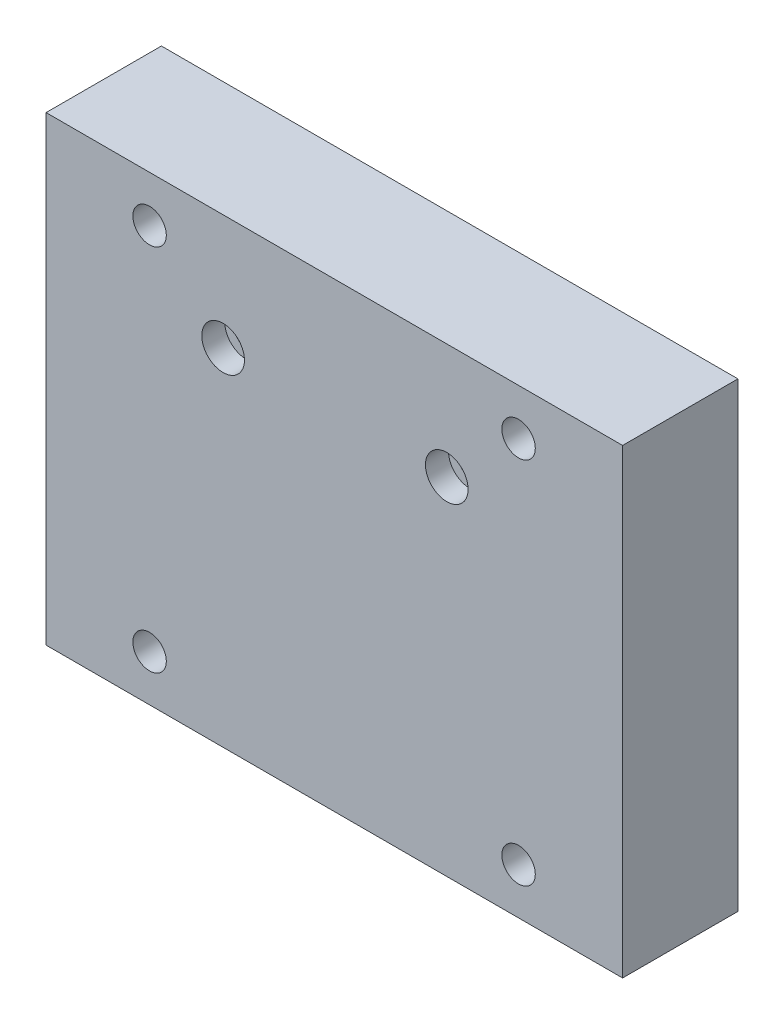
ISO-10303-21;
HEADER;
FILE_DESCRIPTION(('STEP AP214'),'2;1');
FILE_NAME('part.step','',(''),(''),'','','');
FILE_SCHEMA(('AUTOMOTIVE_DESIGN { 1 0 10303 214 1 1 1 1 }'));
ENDSEC;
DATA;
#1=APPLICATION_CONTEXT('core data for automotive mechanical design processes');
#2=APPLICATION_PROTOCOL_DEFINITION('international standard','automotive_design',2000,#1);
#3=PRODUCT_CONTEXT('',#1,'mechanical');
#4=PRODUCT('Part','Part','',(#3));
#5=PRODUCT_RELATED_PRODUCT_CATEGORY('part','',(#4));
#6=PRODUCT_DEFINITION_FORMATION('','',#4);
#7=PRODUCT_DEFINITION_CONTEXT('part definition',#1,'design');
#8=PRODUCT_DEFINITION('design','',#6,#7);
#9=PRODUCT_DEFINITION_SHAPE('','',#8);
#10=(LENGTH_UNIT() NAMED_UNIT(*) SI_UNIT(.MILLI.,.METRE.));
#11=(NAMED_UNIT(*) PLANE_ANGLE_UNIT() SI_UNIT($,.RADIAN.));
#12=(NAMED_UNIT(*) SI_UNIT($,.STERADIAN.) SOLID_ANGLE_UNIT());
#13=UNCERTAINTY_MEASURE_WITH_UNIT(LENGTH_MEASURE(1.E-05),#10,'distance_accuracy_value','');
#14=(GEOMETRIC_REPRESENTATION_CONTEXT(3) GLOBAL_UNCERTAINTY_ASSIGNED_CONTEXT((#13)) GLOBAL_UNIT_ASSIGNED_CONTEXT((#10,
#11,#12)) REPRESENTATION_CONTEXT('',''));
#15=CARTESIAN_POINT('',(0.,0.,0.));
#16=DIRECTION('',(0.,0.,1.));
#17=DIRECTION('',(1.,0.,0.));
#18=AXIS2_PLACEMENT_3D('',#15,#16,#17);
#19=CARTESIAN_POINT('',(9.75168408477417,10.,0.));
#20=DIRECTION('',(0.,0.,1.));
#21=DIRECTION('',(1.,0.,0.));
#22=AXIS2_PLACEMENT_3D('',#19,#20,#21);
#23=CYLINDRICAL_SURFACE('',#22,0.999999999999999);
#24=CARTESIAN_POINT('',(9.75168408477417,10.,6.3));
#25=DIRECTION('',(0.,0.,1.));
#26=DIRECTION('',(1.,0.,0.));
#27=AXIS2_PLACEMENT_3D('',#24,#25,#26);
#28=CIRCLE('',#27,0.999999999999999);
#29=CARTESIAN_POINT('',(10.7516840847742,10.,6.3));
#30=VERTEX_POINT('',#29);
#31=EDGE_CURVE('E152',#30,#30,#28,.F.);
#32=ORIENTED_EDGE('',*,*,#31,.T.);
#33=EDGE_LOOP('',(#32));
#34=FACE_BOUND('',#33,.T.);
#35=CARTESIAN_POINT('',(9.75168408477417,10.,8.));
#36=DIRECTION('',(0.,0.,1.));
#37=DIRECTION('',(1.,0.,0.));
#38=AXIS2_PLACEMENT_3D('',#35,#36,#37);
#39=CIRCLE('',#38,0.999999999999999);
#40=CARTESIAN_POINT('',(10.7516840847742,10.,8.));
#41=VERTEX_POINT('',#40);
#42=EDGE_CURVE('E179',#41,#41,#39,.F.);
#43=ORIENTED_EDGE('',*,*,#42,.F.);
#44=EDGE_LOOP('',(#43));
#45=FACE_BOUND('',#44,.T.);
#46=ADVANCED_FACE('F33',(#34,#45),#23,.F.);
#47=CARTESIAN_POINT('',(-9.64831591522582,10.,0.));
#48=DIRECTION('',(0.,0.,1.));
#49=DIRECTION('',(1.,0.,0.));
#50=AXIS2_PLACEMENT_3D('',#47,#48,#49);
#51=CYLINDRICAL_SURFACE('',#50,0.999999999999999);
#52=CARTESIAN_POINT('',(-9.64831591522582,10.,6.3));
#53=DIRECTION('',(0.,0.,1.));
#54=DIRECTION('',(1.,0.,0.));
#55=AXIS2_PLACEMENT_3D('',#52,#53,#54);
#56=CIRCLE('',#55,0.999999999999999);
#57=CARTESIAN_POINT('',(-8.64831591522583,10.,6.3));
#58=VERTEX_POINT('',#57);
#59=EDGE_CURVE('E37',#58,#58,#56,.F.);
#60=ORIENTED_EDGE('',*,*,#59,.T.);
#61=EDGE_LOOP('',(#60));
#62=FACE_BOUND('',#61,.T.);
#63=CARTESIAN_POINT('',(-9.64831591522582,10.,8.));
#64=DIRECTION('',(0.,0.,1.));
#65=DIRECTION('',(1.,0.,0.));
#66=AXIS2_PLACEMENT_3D('',#63,#64,#65);
#67=CIRCLE('',#66,0.999999999999999);
#68=CARTESIAN_POINT('',(-8.64831591522583,10.,8.));
#69=VERTEX_POINT('',#68);
#70=EDGE_CURVE('E159',#69,#69,#67,.F.);
#71=ORIENTED_EDGE('',*,*,#70,.F.);
#72=EDGE_LOOP('',(#71));
#73=FACE_BOUND('',#72,.T.);
#74=ADVANCED_FACE('F196',(#62,#73),#51,.F.);
#75=CARTESIAN_POINT('',(25.,-20.,10.));
#76=DIRECTION('',(-1.,0.,0.));
#77=DIRECTION('',(0.,0.,1.));
#78=AXIS2_PLACEMENT_3D('',#75,#76,#77);
#79=PLANE('',#78);
#80=DIRECTION('',(0.,1.,0.));
#81=VECTOR('',#80,1.);
#82=CARTESIAN_POINT('',(25.,-20.,0.));
#83=LINE('',#82,#81);
#84=CARTESIAN_POINT('',(25.,-20.,0.));
#85=VERTEX_POINT('',#84);
#86=CARTESIAN_POINT('',(25.,20.,0.));
#87=VERTEX_POINT('',#86);
#88=EDGE_CURVE('E175',#85,#87,#83,.T.);
#89=ORIENTED_EDGE('',*,*,#88,.T.);
#90=DIRECTION('',(0.,0.,-1.));
#91=VECTOR('',#90,1.);
#92=CARTESIAN_POINT('',(25.,20.,10.));
#93=LINE('',#92,#91);
#94=CARTESIAN_POINT('',(25.,20.,10.));
#95=VERTEX_POINT('',#94);
#96=EDGE_CURVE('E11',#95,#87,#93,.T.);
#97=ORIENTED_EDGE('',*,*,#96,.F.);
#98=DIRECTION('',(0.,1.,0.));
#99=VECTOR('',#98,1.);
#100=CARTESIAN_POINT('',(25.,-20.,10.));
#101=LINE('',#100,#99);
#102=CARTESIAN_POINT('',(25.,-20.,10.));
#103=VERTEX_POINT('',#102);
#104=EDGE_CURVE('E168',#103,#95,#101,.T.);
#105=ORIENTED_EDGE('',*,*,#104,.F.);
#106=DIRECTION('',(0.,0.,-1.));
#107=VECTOR('',#106,1.);
#108=CARTESIAN_POINT('',(25.,-20.,10.));
#109=LINE('',#108,#107);
#110=EDGE_CURVE('E174',#103,#85,#109,.T.);
#111=ORIENTED_EDGE('',*,*,#110,.T.);
#112=EDGE_LOOP('',(#89,#97,#105,#111));
#113=FACE_BOUND('',#112,.T.);
#114=ADVANCED_FACE('F35',(#113),#79,.F.);
#115=CARTESIAN_POINT('',(-25.,20.,10.));
#116=DIRECTION('',(0.,-1.,0.));
#117=DIRECTION('',(0.,0.,-1.));
#118=AXIS2_PLACEMENT_3D('',#115,#116,#117);
#119=PLANE('',#118);
#120=DIRECTION('',(-1.,0.,0.));
#121=VECTOR('',#120,1.);
#122=CARTESIAN_POINT('',(-25.,20.,0.));
#123=LINE('',#122,#121);
#124=CARTESIAN_POINT('',(-25.,20.,0.));
#125=VERTEX_POINT('',#124);
#126=EDGE_CURVE('E178',#87,#125,#123,.T.);
#127=ORIENTED_EDGE('',*,*,#126,.T.);
#128=DIRECTION('',(0.,0.,-1.));
#129=VECTOR('',#128,1.);
#130=CARTESIAN_POINT('',(-25.,20.,10.));
#131=LINE('',#130,#129);
#132=CARTESIAN_POINT('',(-25.,20.,10.));
#133=VERTEX_POINT('',#132);
#134=EDGE_CURVE('E42',#133,#125,#131,.T.);
#135=ORIENTED_EDGE('',*,*,#134,.F.);
#136=DIRECTION('',(-1.,0.,0.));
#137=VECTOR('',#136,1.);
#138=CARTESIAN_POINT('',(-25.,20.,10.));
#139=LINE('',#138,#137);
#140=EDGE_CURVE('E87',#95,#133,#139,.T.);
#141=ORIENTED_EDGE('',*,*,#140,.F.);
#142=ORIENTED_EDGE('',*,*,#96,.T.);
#143=EDGE_LOOP('',(#127,#135,#141,#142));
#144=FACE_BOUND('',#143,.T.);
#145=ADVANCED_FACE('F220',(#144),#119,.F.);
#146=CARTESIAN_POINT('',(-25.,-20.,10.));
#147=DIRECTION('',(1.,0.,0.));
#148=DIRECTION('',(0.,0.,-1.));
#149=AXIS2_PLACEMENT_3D('',#146,#147,#148);
#150=PLANE('',#149);
#151=DIRECTION('',(0.,-1.,0.));
#152=VECTOR('',#151,1.);
#153=CARTESIAN_POINT('',(-25.,-20.,0.));
#154=LINE('',#153,#152);
#155=CARTESIAN_POINT('',(-25.,-20.,0.));
#156=VERTEX_POINT('',#155);
#157=EDGE_CURVE('E181',#125,#156,#154,.T.);
#158=ORIENTED_EDGE('',*,*,#157,.T.);
#159=DIRECTION('',(0.,0.,-1.));
#160=VECTOR('',#159,1.);
#161=CARTESIAN_POINT('',(-25.,-20.,10.));
#162=LINE('',#161,#160);
#163=CARTESIAN_POINT('',(-25.,-20.,10.));
#164=VERTEX_POINT('',#163);
#165=EDGE_CURVE('E185',#164,#156,#162,.T.);
#166=ORIENTED_EDGE('',*,*,#165,.F.);
#167=DIRECTION('',(0.,-1.,0.));
#168=VECTOR('',#167,1.);
#169=CARTESIAN_POINT('',(-25.,-20.,10.));
#170=LINE('',#169,#168);
#171=EDGE_CURVE('E171',#133,#164,#170,.T.);
#172=ORIENTED_EDGE('',*,*,#171,.F.);
#173=ORIENTED_EDGE('',*,*,#134,.T.);
#174=EDGE_LOOP('',(#158,#166,#172,#173));
#175=FACE_BOUND('',#174,.T.);
#176=ADVANCED_FACE('F218',(#175),#150,.F.);
#177=CARTESIAN_POINT('',(-25.,-20.,10.));
#178=DIRECTION('',(0.,1.,0.));
#179=DIRECTION('',(0.,0.,1.));
#180=AXIS2_PLACEMENT_3D('',#177,#178,#179);
#181=PLANE('',#180);
#182=DIRECTION('',(1.,0.,0.));
#183=VECTOR('',#182,1.);
#184=CARTESIAN_POINT('',(-25.,-20.,0.));
#185=LINE('',#184,#183);
#186=EDGE_CURVE('E80',#156,#85,#185,.T.);
#187=ORIENTED_EDGE('',*,*,#186,.T.);
#188=ORIENTED_EDGE('',*,*,#110,.F.);
#189=DIRECTION('',(1.,0.,0.));
#190=VECTOR('',#189,1.);
#191=CARTESIAN_POINT('',(-25.,-20.,10.));
#192=LINE('',#191,#190);
#193=EDGE_CURVE('E59',#164,#103,#192,.T.);
#194=ORIENTED_EDGE('',*,*,#193,.F.);
#195=ORIENTED_EDGE('',*,*,#165,.T.);
#196=EDGE_LOOP('',(#187,#188,#194,#195));
#197=FACE_BOUND('',#196,.T.);
#198=ADVANCED_FACE('F210',(#197),#181,.F.);
#199=CARTESIAN_POINT('',(0.,0.,10.));
#200=DIRECTION('',(0.,0.,-1.));
#201=DIRECTION('',(-1.,0.,0.));
#202=AXIS2_PLACEMENT_3D('',#199,#200,#201);
#203=PLANE('',#202);
#204=CARTESIAN_POINT('',(-16.0235298118953,-16.,10.));
#205=DIRECTION('',(0.,0.,1.));
#206=DIRECTION('',(1.,0.,0.));
#207=AXIS2_PLACEMENT_3D('',#204,#205,#206);
#208=CIRCLE('',#207,1.45);
#209=CARTESIAN_POINT('',(-14.5735298118953,-16.,10.));
#210=VERTEX_POINT('',#209);
#211=EDGE_CURVE('E417',#210,#210,#208,.T.);
#212=ORIENTED_EDGE('',*,*,#211,.F.);
#213=EDGE_LOOP('',(#212));
#214=FACE_BOUND('',#213,.T.);
#215=CARTESIAN_POINT('',(15.9764701881047,16.,10.));
#216=DIRECTION('',(0.,0.,1.));
#217=DIRECTION('',(1.,0.,0.));
#218=AXIS2_PLACEMENT_3D('',#215,#216,#217);
#219=CIRCLE('',#218,1.45);
#220=CARTESIAN_POINT('',(17.4264701881047,16.,10.));
#221=VERTEX_POINT('',#220);
#222=EDGE_CURVE('E422',#221,#221,#219,.T.);
#223=ORIENTED_EDGE('',*,*,#222,.F.);
#224=EDGE_LOOP('',(#223));
#225=FACE_BOUND('',#224,.T.);
#226=CARTESIAN_POINT('',(15.9764701881047,-16.,10.));
#227=DIRECTION('',(0.,0.,1.));
#228=DIRECTION('',(1.,0.,0.));
#229=AXIS2_PLACEMENT_3D('',#226,#227,#228);
#230=CIRCLE('',#229,1.45);
#231=CARTESIAN_POINT('',(17.4264701881047,-16.,10.));
#232=VERTEX_POINT('',#231);
#233=EDGE_CURVE('E441',#232,#232,#230,.T.);
#234=ORIENTED_EDGE('',*,*,#233,.F.);
#235=EDGE_LOOP('',(#234));
#236=FACE_BOUND('',#235,.T.);
#237=CARTESIAN_POINT('',(-16.0235298118953,16.,10.));
#238=DIRECTION('',(0.,0.,1.));
#239=DIRECTION('',(1.,0.,0.));
#240=AXIS2_PLACEMENT_3D('',#237,#238,#239);
#241=CIRCLE('',#240,1.45);
#242=CARTESIAN_POINT('',(-14.5735298118953,16.,10.));
#243=VERTEX_POINT('',#242);
#244=EDGE_CURVE('E136',#243,#243,#241,.T.);
#245=ORIENTED_EDGE('',*,*,#244,.F.);
#246=EDGE_LOOP('',(#245));
#247=FACE_BOUND('',#246,.T.);
#248=CARTESIAN_POINT('',(-9.64831591522582,10.,10.));
#249=DIRECTION('',(0.,0.,1.));
#250=DIRECTION('',(1.,0.,0.));
#251=AXIS2_PLACEMENT_3D('',#248,#249,#250);
#252=CIRCLE('',#251,1.85);
#253=CARTESIAN_POINT('',(-7.79831591522583,10.,10.));
#254=VERTEX_POINT('',#253);
#255=EDGE_CURVE('E160',#254,#254,#252,.T.);
#256=ORIENTED_EDGE('',*,*,#255,.F.);
#257=EDGE_LOOP('',(#256));
#258=FACE_BOUND('',#257,.T.);
#259=CARTESIAN_POINT('',(9.75168408477417,10.,10.));
#260=DIRECTION('',(0.,0.,1.));
#261=DIRECTION('',(1.,0.,0.));
#262=AXIS2_PLACEMENT_3D('',#259,#260,#261);
#263=CIRCLE('',#262,1.85);
#264=CARTESIAN_POINT('',(11.6016840847742,10.,10.));
#265=VERTEX_POINT('',#264);
#266=EDGE_CURVE('E155',#265,#265,#263,.T.);
#267=ORIENTED_EDGE('',*,*,#266,.F.);
#268=EDGE_LOOP('',(#267));
#269=FACE_BOUND('',#268,.T.);
#270=ORIENTED_EDGE('',*,*,#104,.T.);
#271=ORIENTED_EDGE('',*,*,#140,.T.);
#272=ORIENTED_EDGE('',*,*,#171,.T.);
#273=ORIENTED_EDGE('',*,*,#193,.T.);
#274=EDGE_LOOP('',(#270,#271,#272,#273));
#275=FACE_BOUND('',#274,.T.);
#276=ADVANCED_FACE('F206',(#214,#225,#236,#247,#258,#269,#275),#203,.F.);
#277=CARTESIAN_POINT('',(0.,0.,0.));
#278=DIRECTION('',(0.,0.,-1.));
#279=DIRECTION('',(-1.,0.,0.));
#280=AXIS2_PLACEMENT_3D('',#277,#278,#279);
#281=PLANE('',#280);
#282=CARTESIAN_POINT('',(-16.0235298118953,-16.,0.));
#283=DIRECTION('',(0.,0.,1.));
#284=DIRECTION('',(1.,0.,0.));
#285=AXIS2_PLACEMENT_3D('',#282,#283,#284);
#286=CIRCLE('',#285,1.45);
#287=CARTESIAN_POINT('',(-14.5735298118953,-16.,0.));
#288=VERTEX_POINT('',#287);
#289=EDGE_CURVE('E414',#288,#288,#286,.T.);
#290=ORIENTED_EDGE('',*,*,#289,.T.);
#291=EDGE_LOOP('',(#290));
#292=FACE_BOUND('',#291,.T.);
#293=CARTESIAN_POINT('',(15.9764701881047,16.,0.));
#294=DIRECTION('',(0.,0.,1.));
#295=DIRECTION('',(1.,0.,0.));
#296=AXIS2_PLACEMENT_3D('',#293,#294,#295);
#297=CIRCLE('',#296,1.45);
#298=CARTESIAN_POINT('',(17.4264701881047,16.,0.));
#299=VERTEX_POINT('',#298);
#300=EDGE_CURVE('E418',#299,#299,#297,.T.);
#301=ORIENTED_EDGE('',*,*,#300,.T.);
#302=EDGE_LOOP('',(#301));
#303=FACE_BOUND('',#302,.T.);
#304=CARTESIAN_POINT('',(15.9764701881047,-16.,0.));
#305=DIRECTION('',(0.,0.,1.));
#306=DIRECTION('',(1.,0.,0.));
#307=AXIS2_PLACEMENT_3D('',#304,#305,#306);
#308=CIRCLE('',#307,1.45);
#309=CARTESIAN_POINT('',(17.4264701881047,-16.,0.));
#310=VERTEX_POINT('',#309);
#311=EDGE_CURVE('E427',#310,#310,#308,.T.);
#312=ORIENTED_EDGE('',*,*,#311,.T.);
#313=EDGE_LOOP('',(#312));
#314=FACE_BOUND('',#313,.T.);
#315=CARTESIAN_POINT('',(-16.0235298118953,16.,0.));
#316=DIRECTION('',(0.,0.,1.));
#317=DIRECTION('',(1.,0.,0.));
#318=AXIS2_PLACEMENT_3D('',#315,#316,#317);
#319=CIRCLE('',#318,1.45);
#320=CARTESIAN_POINT('',(-14.5735298118953,16.,0.));
#321=VERTEX_POINT('',#320);
#322=EDGE_CURVE('E143',#321,#321,#319,.T.);
#323=ORIENTED_EDGE('',*,*,#322,.T.);
#324=EDGE_LOOP('',(#323));
#325=FACE_BOUND('',#324,.T.);
#326=DIRECTION('',(0.,1.,0.));
#327=VECTOR('',#326,1.);
#328=CARTESIAN_POINT('',(-13.,7.,0.));
#329=LINE('',#328,#327);
#330=CARTESIAN_POINT('',(-13.,7.,0.));
#331=VERTEX_POINT('',#330);
#332=CARTESIAN_POINT('',(-13.,13.,0.));
#333=VERTEX_POINT('',#332);
#334=EDGE_CURVE('E50',#331,#333,#329,.T.);
#335=ORIENTED_EDGE('',*,*,#334,.F.);
#336=DIRECTION('',(-1.,0.,0.));
#337=VECTOR('',#336,1.);
#338=CARTESIAN_POINT('',(13.,7.,0.));
#339=LINE('',#338,#337);
#340=CARTESIAN_POINT('',(13.,7.,0.));
#341=VERTEX_POINT('',#340);
#342=EDGE_CURVE('E130',#341,#331,#339,.T.);
#343=ORIENTED_EDGE('',*,*,#342,.F.);
#344=DIRECTION('',(0.,-1.,0.));
#345=VECTOR('',#344,1.);
#346=CARTESIAN_POINT('',(13.,7.,0.));
#347=LINE('',#346,#345);
#348=CARTESIAN_POINT('',(13.,13.,0.));
#349=VERTEX_POINT('',#348);
#350=EDGE_CURVE('E133',#349,#341,#347,.T.);
#351=ORIENTED_EDGE('',*,*,#350,.F.);
#352=DIRECTION('',(1.,0.,0.));
#353=VECTOR('',#352,1.);
#354=CARTESIAN_POINT('',(13.,13.,0.));
#355=LINE('',#354,#353);
#356=EDGE_CURVE('E142',#333,#349,#355,.T.);
#357=ORIENTED_EDGE('',*,*,#356,.F.);
#358=EDGE_LOOP('',(#335,#343,#351,#357));
#359=FACE_BOUND('',#358,.T.);
#360=ORIENTED_EDGE('',*,*,#88,.F.);
#361=ORIENTED_EDGE('',*,*,#186,.F.);
#362=ORIENTED_EDGE('',*,*,#157,.F.);
#363=ORIENTED_EDGE('',*,*,#126,.F.);
#364=EDGE_LOOP('',(#360,#361,#362,#363));
#365=FACE_BOUND('',#364,.T.);
#366=ADVANCED_FACE('F209',(#292,#303,#314,#325,#359,#365),#281,.T.);
#367=CARTESIAN_POINT('',(-9.64831591522582,10.,8.));
#368=DIRECTION('',(0.,0.,1.));
#369=DIRECTION('',(1.,0.,0.));
#370=AXIS2_PLACEMENT_3D('',#367,#368,#369);
#371=PLANE('',#370);
#372=CARTESIAN_POINT('',(-9.64831591522582,10.,8.));
#373=DIRECTION('',(0.,0.,1.));
#374=DIRECTION('',(1.,0.,0.));
#375=AXIS2_PLACEMENT_3D('',#372,#373,#374);
#376=CIRCLE('',#375,1.85);
#377=CARTESIAN_POINT('',(-7.79831591522583,10.,8.));
#378=VERTEX_POINT('',#377);
#379=EDGE_CURVE('E156',#378,#378,#376,.T.);
#380=ORIENTED_EDGE('',*,*,#379,.T.);
#381=EDGE_LOOP('',(#380));
#382=FACE_BOUND('',#381,.T.);
#383=ORIENTED_EDGE('',*,*,#70,.T.);
#384=EDGE_LOOP('',(#383));
#385=FACE_BOUND('',#384,.T.);
#386=ADVANCED_FACE('F214',(#382,#385),#371,.T.);
#387=CARTESIAN_POINT('',(-9.64831591522582,10.,8.));
#388=DIRECTION('',(0.,0.,1.));
#389=DIRECTION('',(1.,0.,0.));
#390=AXIS2_PLACEMENT_3D('',#387,#388,#389);
#391=CYLINDRICAL_SURFACE('',#390,1.85);
#392=ORIENTED_EDGE('',*,*,#379,.F.);
#393=EDGE_LOOP('',(#392));
#394=FACE_BOUND('',#393,.T.);
#395=ORIENTED_EDGE('',*,*,#255,.T.);
#396=EDGE_LOOP('',(#395));
#397=FACE_BOUND('',#396,.T.);
#398=ADVANCED_FACE('F353',(#394,#397),#391,.F.);
#399=CARTESIAN_POINT('',(9.75168408477417,10.,8.));
#400=DIRECTION('',(0.,0.,1.));
#401=DIRECTION('',(1.,0.,0.));
#402=AXIS2_PLACEMENT_3D('',#399,#400,#401);
#403=PLANE('',#402);
#404=CARTESIAN_POINT('',(9.75168408477417,10.,8.));
#405=DIRECTION('',(0.,0.,1.));
#406=DIRECTION('',(1.,0.,0.));
#407=AXIS2_PLACEMENT_3D('',#404,#405,#406);
#408=CIRCLE('',#407,1.85);
#409=CARTESIAN_POINT('',(11.6016840847742,10.,8.));
#410=VERTEX_POINT('',#409);
#411=EDGE_CURVE('E163',#410,#410,#408,.T.);
#412=ORIENTED_EDGE('',*,*,#411,.T.);
#413=EDGE_LOOP('',(#412));
#414=FACE_BOUND('',#413,.T.);
#415=ORIENTED_EDGE('',*,*,#42,.T.);
#416=EDGE_LOOP('',(#415));
#417=FACE_BOUND('',#416,.T.);
#418=ADVANCED_FACE('F193',(#414,#417),#403,.T.);
#419=CARTESIAN_POINT('',(9.75168408477417,10.,8.));
#420=DIRECTION('',(0.,0.,1.));
#421=DIRECTION('',(1.,0.,0.));
#422=AXIS2_PLACEMENT_3D('',#419,#420,#421);
#423=CYLINDRICAL_SURFACE('',#422,1.85);
#424=ORIENTED_EDGE('',*,*,#411,.F.);
#425=EDGE_LOOP('',(#424));
#426=FACE_BOUND('',#425,.T.);
#427=ORIENTED_EDGE('',*,*,#266,.T.);
#428=EDGE_LOOP('',(#427));
#429=FACE_BOUND('',#428,.T.);
#430=ADVANCED_FACE('F253',(#426,#429),#423,.F.);
#431=CARTESIAN_POINT('',(0.,0.,6.3));
#432=DIRECTION('',(0.,0.,1.));
#433=DIRECTION('',(1.,0.,0.));
#434=AXIS2_PLACEMENT_3D('',#431,#432,#433);
#435=PLANE('',#434);
#436=ORIENTED_EDGE('',*,*,#59,.F.);
#437=EDGE_LOOP('',(#436));
#438=FACE_BOUND('',#437,.T.);
#439=DIRECTION('',(0.,1.,0.));
#440=VECTOR('',#439,1.);
#441=CARTESIAN_POINT('',(-13.,7.,6.3));
#442=LINE('',#441,#440);
#443=CARTESIAN_POINT('',(-13.,7.,6.3));
#444=VERTEX_POINT('',#443);
#445=CARTESIAN_POINT('',(-13.,13.,6.3));
#446=VERTEX_POINT('',#445);
#447=EDGE_CURVE('E111',#444,#446,#442,.T.);
#448=ORIENTED_EDGE('',*,*,#447,.T.);
#449=DIRECTION('',(1.,0.,0.));
#450=VECTOR('',#449,1.);
#451=CARTESIAN_POINT('',(13.,13.,6.3));
#452=LINE('',#451,#450);
#453=CARTESIAN_POINT('',(13.,13.,6.3));
#454=VERTEX_POINT('',#453);
#455=EDGE_CURVE('E120',#446,#454,#452,.T.);
#456=ORIENTED_EDGE('',*,*,#455,.T.);
#457=DIRECTION('',(0.,-1.,0.));
#458=VECTOR('',#457,1.);
#459=CARTESIAN_POINT('',(13.,7.,6.3));
#460=LINE('',#459,#458);
#461=CARTESIAN_POINT('',(13.,7.,6.3));
#462=VERTEX_POINT('',#461);
#463=EDGE_CURVE('E125',#454,#462,#460,.T.);
#464=ORIENTED_EDGE('',*,*,#463,.T.);
#465=DIRECTION('',(-1.,0.,0.));
#466=VECTOR('',#465,1.);
#467=CARTESIAN_POINT('',(13.,7.,6.3));
#468=LINE('',#467,#466);
#469=EDGE_CURVE('E117',#462,#444,#468,.T.);
#470=ORIENTED_EDGE('',*,*,#469,.T.);
#471=EDGE_LOOP('',(#448,#456,#464,#470));
#472=FACE_BOUND('',#471,.T.);
#473=ORIENTED_EDGE('',*,*,#31,.F.);
#474=EDGE_LOOP('',(#473));
#475=FACE_BOUND('',#474,.T.);
#476=ADVANCED_FACE('F127',(#438,#472,#475),#435,.F.);
#477=CARTESIAN_POINT('',(-13.,7.,6.3));
#478=DIRECTION('',(-1.,0.,0.));
#479=DIRECTION('',(0.,0.,1.));
#480=AXIS2_PLACEMENT_3D('',#477,#478,#479);
#481=PLANE('',#480);
#482=ORIENTED_EDGE('',*,*,#334,.T.);
#483=DIRECTION('',(0.,0.,-1.));
#484=VECTOR('',#483,1.);
#485=CARTESIAN_POINT('',(-13.,13.,6.3));
#486=LINE('',#485,#484);
#487=EDGE_CURVE('E107',#446,#333,#486,.T.);
#488=ORIENTED_EDGE('',*,*,#487,.F.);
#489=ORIENTED_EDGE('',*,*,#447,.F.);
#490=DIRECTION('',(0.,0.,-1.));
#491=VECTOR('',#490,1.);
#492=CARTESIAN_POINT('',(-13.,7.,6.3));
#493=LINE('',#492,#491);
#494=EDGE_CURVE('E147',#444,#331,#493,.T.);
#495=ORIENTED_EDGE('',*,*,#494,.T.);
#496=EDGE_LOOP('',(#482,#488,#489,#495));
#497=FACE_BOUND('',#496,.T.);
#498=ADVANCED_FACE('F109',(#497),#481,.F.);
#499=CARTESIAN_POINT('',(13.,7.,6.3));
#500=DIRECTION('',(0.,-1.,0.));
#501=DIRECTION('',(0.,0.,-1.));
#502=AXIS2_PLACEMENT_3D('',#499,#500,#501);
#503=PLANE('',#502);
#504=ORIENTED_EDGE('',*,*,#342,.T.);
#505=ORIENTED_EDGE('',*,*,#494,.F.);
#506=ORIENTED_EDGE('',*,*,#469,.F.);
#507=DIRECTION('',(0.,0.,-1.));
#508=VECTOR('',#507,1.);
#509=CARTESIAN_POINT('',(13.,7.,6.3));
#510=LINE('',#509,#508);
#511=EDGE_CURVE('E149',#462,#341,#510,.T.);
#512=ORIENTED_EDGE('',*,*,#511,.T.);
#513=EDGE_LOOP('',(#504,#505,#506,#512));
#514=FACE_BOUND('',#513,.T.);
#515=ADVANCED_FACE('F265',(#514),#503,.F.);
#516=CARTESIAN_POINT('',(13.,7.,6.3));
#517=DIRECTION('',(1.,0.,0.));
#518=DIRECTION('',(0.,0.,-1.));
#519=AXIS2_PLACEMENT_3D('',#516,#517,#518);
#520=PLANE('',#519);
#521=ORIENTED_EDGE('',*,*,#350,.T.);
#522=ORIENTED_EDGE('',*,*,#511,.F.);
#523=ORIENTED_EDGE('',*,*,#463,.F.);
#524=DIRECTION('',(0.,0.,-1.));
#525=VECTOR('',#524,1.);
#526=CARTESIAN_POINT('',(13.,13.,6.3));
#527=LINE('',#526,#525);
#528=EDGE_CURVE('E116',#454,#349,#527,.T.);
#529=ORIENTED_EDGE('',*,*,#528,.T.);
#530=EDGE_LOOP('',(#521,#522,#523,#529));
#531=FACE_BOUND('',#530,.T.);
#532=ADVANCED_FACE('F274',(#531),#520,.F.);
#533=CARTESIAN_POINT('',(13.,13.,6.3));
#534=DIRECTION('',(0.,1.,0.));
#535=DIRECTION('',(0.,0.,1.));
#536=AXIS2_PLACEMENT_3D('',#533,#534,#535);
#537=PLANE('',#536);
#538=ORIENTED_EDGE('',*,*,#356,.T.);
#539=ORIENTED_EDGE('',*,*,#528,.F.);
#540=ORIENTED_EDGE('',*,*,#455,.F.);
#541=ORIENTED_EDGE('',*,*,#487,.T.);
#542=EDGE_LOOP('',(#538,#539,#540,#541));
#543=FACE_BOUND('',#542,.T.);
#544=ADVANCED_FACE('F121',(#543),#537,.F.);
#545=CARTESIAN_POINT('',(-16.0235298118953,16.,0.));
#546=DIRECTION('',(0.,0.,1.));
#547=DIRECTION('',(1.,0.,0.));
#548=AXIS2_PLACEMENT_3D('',#545,#546,#547);
#549=CYLINDRICAL_SURFACE('',#548,1.45);
#550=ORIENTED_EDGE('',*,*,#322,.F.);
#551=EDGE_LOOP('',(#550));
#552=FACE_BOUND('',#551,.T.);
#553=ORIENTED_EDGE('',*,*,#244,.T.);
#554=EDGE_LOOP('',(#553));
#555=FACE_BOUND('',#554,.T.);
#556=ADVANCED_FACE('F293',(#552,#555),#549,.F.);
#557=CARTESIAN_POINT('',(15.9764701881047,-16.,0.));
#558=DIRECTION('',(0.,0.,1.));
#559=DIRECTION('',(1.,0.,0.));
#560=AXIS2_PLACEMENT_3D('',#557,#558,#559);
#561=CYLINDRICAL_SURFACE('',#560,1.45);
#562=ORIENTED_EDGE('',*,*,#311,.F.);
#563=EDGE_LOOP('',(#562));
#564=FACE_BOUND('',#563,.T.);
#565=ORIENTED_EDGE('',*,*,#233,.T.);
#566=EDGE_LOOP('',(#565));
#567=FACE_BOUND('',#566,.T.);
#568=ADVANCED_FACE('F315',(#564,#567),#561,.F.);
#569=CARTESIAN_POINT('',(15.9764701881047,16.,0.));
#570=DIRECTION('',(0.,0.,1.));
#571=DIRECTION('',(1.,0.,0.));
#572=AXIS2_PLACEMENT_3D('',#569,#570,#571);
#573=CYLINDRICAL_SURFACE('',#572,1.45);
#574=ORIENTED_EDGE('',*,*,#300,.F.);
#575=EDGE_LOOP('',(#574));
#576=FACE_BOUND('',#575,.T.);
#577=ORIENTED_EDGE('',*,*,#222,.T.);
#578=EDGE_LOOP('',(#577));
#579=FACE_BOUND('',#578,.T.);
#580=ADVANCED_FACE('F325',(#576,#579),#573,.F.);
#581=CARTESIAN_POINT('',(-16.0235298118953,-16.,0.));
#582=DIRECTION('',(0.,0.,1.));
#583=DIRECTION('',(1.,0.,0.));
#584=AXIS2_PLACEMENT_3D('',#581,#582,#583);
#585=CYLINDRICAL_SURFACE('',#584,1.45);
#586=ORIENTED_EDGE('',*,*,#289,.F.);
#587=EDGE_LOOP('',(#586));
#588=FACE_BOUND('',#587,.T.);
#589=ORIENTED_EDGE('',*,*,#211,.T.);
#590=EDGE_LOOP('',(#589));
#591=FACE_BOUND('',#590,.T.);
#592=ADVANCED_FACE('F335',(#588,#591),#585,.F.);
#593=CLOSED_SHELL('',(#46,#74,#114,#145,#176,#198,#276,#366,#386,#398,#418,#430,#476,#498,#515,
#532,#544,#556,#568,#580,#592));
#594=MANIFOLD_SOLID_BREP('B2',#593);
#595=ADVANCED_BREP_SHAPE_REPRESENTATION('',(#18,#594),#14);
#596=SHAPE_DEFINITION_REPRESENTATION(#9,#595);
ENDSEC;
END-ISO-10303-21;
